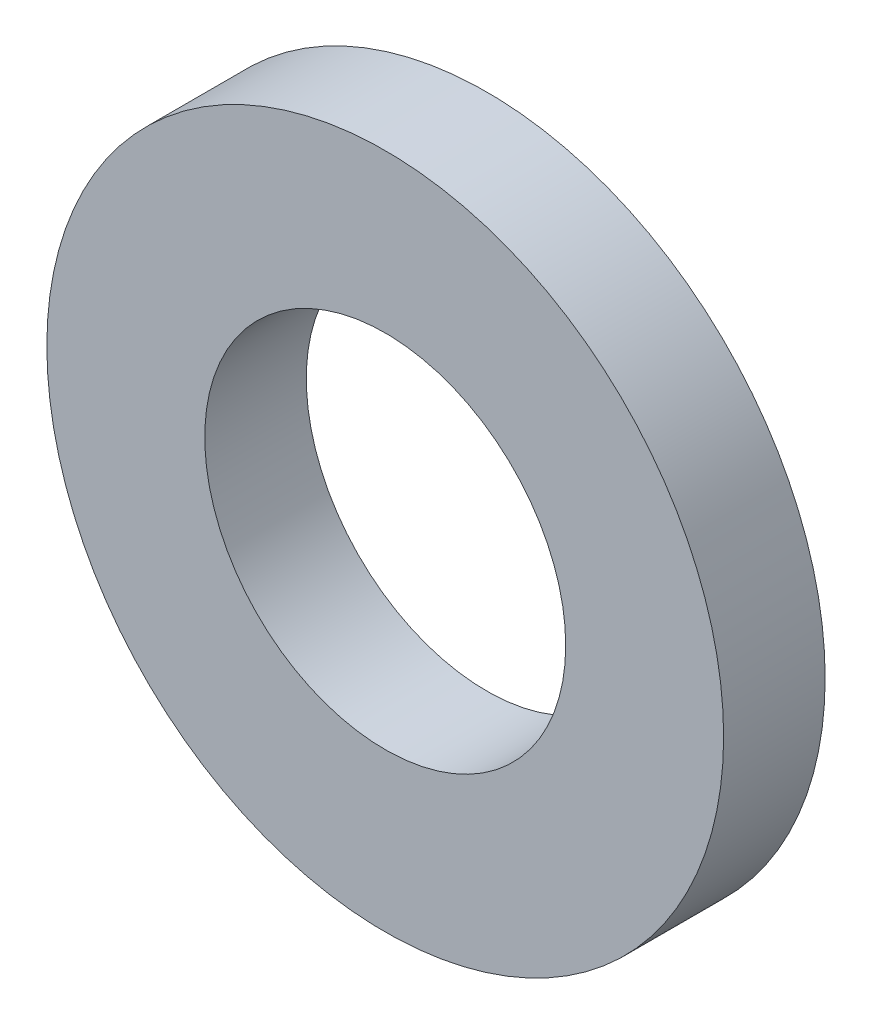
ISO-10303-21;
HEADER;
FILE_DESCRIPTION(('STEP AP214'),'2;1');
FILE_NAME('part.step','',(''),(''),'','','');
FILE_SCHEMA(('AUTOMOTIVE_DESIGN { 1 0 10303 214 1 1 1 1 }'));
ENDSEC;
DATA;
#1=APPLICATION_CONTEXT('core data for automotive mechanical design processes');
#2=APPLICATION_PROTOCOL_DEFINITION('international standard','automotive_design',2000,#1);
#3=PRODUCT_CONTEXT('',#1,'mechanical');
#4=PRODUCT('Part','Part','',(#3));
#5=PRODUCT_RELATED_PRODUCT_CATEGORY('part','',(#4));
#6=PRODUCT_DEFINITION_FORMATION('','',#4);
#7=PRODUCT_DEFINITION_CONTEXT('part definition',#1,'design');
#8=PRODUCT_DEFINITION('design','',#6,#7);
#9=PRODUCT_DEFINITION_SHAPE('','',#8);
#10=(LENGTH_UNIT() NAMED_UNIT(*) SI_UNIT(.MILLI.,.METRE.));
#11=(NAMED_UNIT(*) PLANE_ANGLE_UNIT() SI_UNIT($,.RADIAN.));
#12=(NAMED_UNIT(*) SI_UNIT($,.STERADIAN.) SOLID_ANGLE_UNIT());
#13=UNCERTAINTY_MEASURE_WITH_UNIT(LENGTH_MEASURE(1.E-05),#10,'distance_accuracy_value','');
#14=(GEOMETRIC_REPRESENTATION_CONTEXT(3) GLOBAL_UNCERTAINTY_ASSIGNED_CONTEXT((#13)) GLOBAL_UNIT_ASSIGNED_CONTEXT((#10,
#11,#12)) REPRESENTATION_CONTEXT('',''));
#15=CARTESIAN_POINT('',(0.,0.,0.));
#16=DIRECTION('',(0.,0.,1.));
#17=DIRECTION('',(1.,0.,0.));
#18=AXIS2_PLACEMENT_3D('',#15,#16,#17);
#19=CARTESIAN_POINT('',(0.,0.,1.8));
#20=DIRECTION('',(0.,0.,1.));
#21=DIRECTION('',(1.,0.,0.));
#22=AXIS2_PLACEMENT_3D('',#19,#20,#21);
#23=PLANE('',#22);
#24=CARTESIAN_POINT('',(0.,0.,1.8));
#25=DIRECTION('',(0.,0.,1.));
#26=DIRECTION('',(1.,0.,0.));
#27=AXIS2_PLACEMENT_3D('',#24,#25,#26);
#28=CIRCLE('',#27,6.);
#29=CARTESIAN_POINT('',(6.,0.,1.8));
#30=VERTEX_POINT('',#29);
#31=EDGE_CURVE('E10',#30,#30,#28,.T.);
#32=ORIENTED_EDGE('',*,*,#31,.T.);
#33=EDGE_LOOP('',(#32));
#34=FACE_BOUND('',#33,.T.);
#35=CARTESIAN_POINT('',(0.,0.,1.8));
#36=DIRECTION('',(0.,0.,1.));
#37=DIRECTION('',(1.,0.,0.));
#38=AXIS2_PLACEMENT_3D('',#35,#36,#37);
#39=CIRCLE('',#38,3.2);
#40=CARTESIAN_POINT('',(3.2,0.,1.8));
#41=VERTEX_POINT('',#40);
#42=EDGE_CURVE('E52',#41,#41,#39,.T.);
#43=ORIENTED_EDGE('',*,*,#42,.F.);
#44=EDGE_LOOP('',(#43));
#45=FACE_BOUND('',#44,.T.);
#46=ADVANCED_FACE('F39',(#34,#45),#23,.T.);
#47=CARTESIAN_POINT('',(0.,0.,0.));
#48=DIRECTION('',(0.,0.,1.));
#49=DIRECTION('',(1.,0.,0.));
#50=AXIS2_PLACEMENT_3D('',#47,#48,#49);
#51=PLANE('',#50);
#52=CARTESIAN_POINT('',(0.,0.,0.));
#53=DIRECTION('',(0.,0.,1.));
#54=DIRECTION('',(1.,0.,0.));
#55=AXIS2_PLACEMENT_3D('',#52,#53,#54);
#56=CIRCLE('',#55,6.);
#57=CARTESIAN_POINT('',(6.,0.,0.));
#58=VERTEX_POINT('',#57);
#59=EDGE_CURVE('E43',#58,#58,#56,.T.);
#60=ORIENTED_EDGE('',*,*,#59,.F.);
#61=EDGE_LOOP('',(#60));
#62=FACE_BOUND('',#61,.T.);
#63=CARTESIAN_POINT('',(0.,0.,0.));
#64=DIRECTION('',(0.,0.,1.));
#65=DIRECTION('',(1.,0.,0.));
#66=AXIS2_PLACEMENT_3D('',#63,#64,#65);
#67=CIRCLE('',#66,3.2);
#68=CARTESIAN_POINT('',(3.2,0.,0.));
#69=VERTEX_POINT('',#68);
#70=EDGE_CURVE('E54',#69,#69,#67,.T.);
#71=ORIENTED_EDGE('',*,*,#70,.T.);
#72=EDGE_LOOP('',(#71));
#73=FACE_BOUND('',#72,.T.);
#74=ADVANCED_FACE('F66',(#62,#73),#51,.F.);
#75=CARTESIAN_POINT('',(0.,0.,1.8));
#76=DIRECTION('',(0.,0.,-1.));
#77=DIRECTION('',(-1.,0.,0.));
#78=AXIS2_PLACEMENT_3D('',#75,#76,#77);
#79=CYLINDRICAL_SURFACE('',#78,6.);
#80=ORIENTED_EDGE('',*,*,#31,.F.);
#81=EDGE_LOOP('',(#80));
#82=FACE_BOUND('',#81,.T.);
#83=ORIENTED_EDGE('',*,*,#59,.T.);
#84=EDGE_LOOP('',(#83));
#85=FACE_BOUND('',#84,.T.);
#86=ADVANCED_FACE('F41',(#82,#85),#79,.T.);
#87=CARTESIAN_POINT('',(0.,0.,1.8));
#88=DIRECTION('',(0.,0.,-1.));
#89=DIRECTION('',(-1.,0.,0.));
#90=AXIS2_PLACEMENT_3D('',#87,#88,#89);
#91=CYLINDRICAL_SURFACE('',#90,3.2);
#92=ORIENTED_EDGE('',*,*,#42,.T.);
#93=EDGE_LOOP('',(#92));
#94=FACE_BOUND('',#93,.T.);
#95=ORIENTED_EDGE('',*,*,#70,.F.);
#96=EDGE_LOOP('',(#95));
#97=FACE_BOUND('',#96,.T.);
#98=ADVANCED_FACE('F62',(#94,#97),#91,.F.);
#99=CLOSED_SHELL('',(#46,#74,#86,#98));
#100=MANIFOLD_SOLID_BREP('B2',#99);
#101=ADVANCED_BREP_SHAPE_REPRESENTATION('',(#18,#100),#14);
#102=SHAPE_DEFINITION_REPRESENTATION(#9,#101);
ENDSEC;
END-ISO-10303-21;
